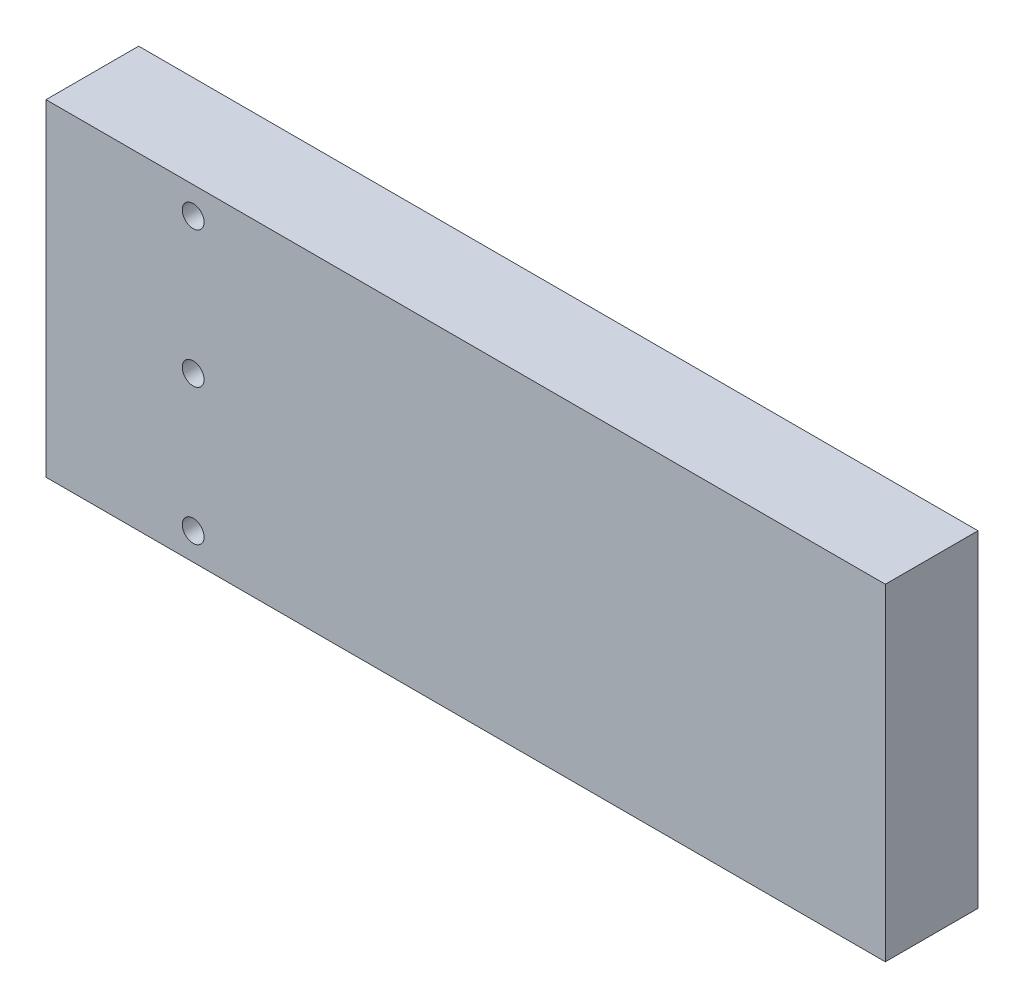
ISO-10303-21;
HEADER;
FILE_DESCRIPTION(('STEP AP214'),'2;1');
FILE_NAME('part.step','',(''),(''),'','','');
FILE_SCHEMA(('AUTOMOTIVE_DESIGN { 1 0 10303 214 1 1 1 1 }'));
ENDSEC;
DATA;
#1=APPLICATION_CONTEXT('core data for automotive mechanical design processes');
#2=APPLICATION_PROTOCOL_DEFINITION('international standard','automotive_design',2000,#1);
#3=PRODUCT_CONTEXT('',#1,'mechanical');
#4=PRODUCT('Part','Part','',(#3));
#5=PRODUCT_RELATED_PRODUCT_CATEGORY('part','',(#4));
#6=PRODUCT_DEFINITION_FORMATION('','',#4);
#7=PRODUCT_DEFINITION_CONTEXT('part definition',#1,'design');
#8=PRODUCT_DEFINITION('design','',#6,#7);
#9=PRODUCT_DEFINITION_SHAPE('','',#8);
#10=(LENGTH_UNIT() NAMED_UNIT(*) SI_UNIT(.MILLI.,.METRE.));
#11=(NAMED_UNIT(*) PLANE_ANGLE_UNIT() SI_UNIT($,.RADIAN.));
#12=(NAMED_UNIT(*) SI_UNIT($,.STERADIAN.) SOLID_ANGLE_UNIT());
#13=UNCERTAINTY_MEASURE_WITH_UNIT(LENGTH_MEASURE(1.E-05),#10,'distance_accuracy_value','');
#14=(GEOMETRIC_REPRESENTATION_CONTEXT(3) GLOBAL_UNCERTAINTY_ASSIGNED_CONTEXT((#13)) GLOBAL_UNIT_ASSIGNED_CONTEXT((#10,
#11,#12)) REPRESENTATION_CONTEXT('',''));
#15=CARTESIAN_POINT('',(0.,0.,0.));
#16=DIRECTION('',(0.,0.,1.));
#17=DIRECTION('',(1.,0.,0.));
#18=AXIS2_PLACEMENT_3D('',#15,#16,#17);
#19=CARTESIAN_POINT('',(0.,-60.,17.));
#20=DIRECTION('',(0.,1.,0.));
#21=DIRECTION('',(0.,0.,1.));
#22=AXIS2_PLACEMENT_3D('',#19,#20,#21);
#23=PLANE('',#22);
#24=DIRECTION('',(1.,0.,0.));
#25=VECTOR('',#24,1.);
#26=CARTESIAN_POINT('',(0.,-60.,0.));
#27=LINE('',#26,#25);
#28=CARTESIAN_POINT('',(0.,-60.,0.));
#29=VERTEX_POINT('',#28);
#30=CARTESIAN_POINT('',(154.,-60.,0.));
#31=VERTEX_POINT('',#30);
#32=EDGE_CURVE('E107',#29,#31,#27,.T.);
#33=ORIENTED_EDGE('',*,*,#32,.T.);
#34=DIRECTION('',(0.,0.,-1.));
#35=VECTOR('',#34,1.);
#36=CARTESIAN_POINT('',(154.,-60.,17.));
#37=LINE('',#36,#35);
#38=CARTESIAN_POINT('',(154.,-60.,17.));
#39=VERTEX_POINT('',#38);
#40=EDGE_CURVE('E11',#39,#31,#37,.T.);
#41=ORIENTED_EDGE('',*,*,#40,.F.);
#42=DIRECTION('',(1.,0.,0.));
#43=VECTOR('',#42,1.);
#44=CARTESIAN_POINT('',(0.,-60.,17.));
#45=LINE('',#44,#43);
#46=CARTESIAN_POINT('',(0.,-60.,17.));
#47=VERTEX_POINT('',#46);
#48=EDGE_CURVE('E83',#47,#39,#45,.T.);
#49=ORIENTED_EDGE('',*,*,#48,.F.);
#50=DIRECTION('',(0.,0.,-1.));
#51=VECTOR('',#50,1.);
#52=CARTESIAN_POINT('',(0.,-60.,17.));
#53=LINE('',#52,#51);
#54=EDGE_CURVE('E94',#47,#29,#53,.T.);
#55=ORIENTED_EDGE('',*,*,#54,.T.);
#56=EDGE_LOOP('',(#33,#41,#49,#55));
#57=FACE_BOUND('',#56,.T.);
#58=ADVANCED_FACE('F35',(#57),#23,.F.);
#59=CARTESIAN_POINT('',(154.,0.,17.));
#60=DIRECTION('',(-1.,0.,0.));
#61=DIRECTION('',(0.,0.,1.));
#62=AXIS2_PLACEMENT_3D('',#59,#60,#61);
#63=PLANE('',#62);
#64=DIRECTION('',(0.,1.,0.));
#65=VECTOR('',#64,1.);
#66=CARTESIAN_POINT('',(154.,0.,0.));
#67=LINE('',#66,#65);
#68=CARTESIAN_POINT('',(154.,0.,0.));
#69=VERTEX_POINT('',#68);
#70=EDGE_CURVE('E88',#31,#69,#67,.T.);
#71=ORIENTED_EDGE('',*,*,#70,.T.);
#72=DIRECTION('',(0.,0.,-1.));
#73=VECTOR('',#72,1.);
#74=CARTESIAN_POINT('',(154.,0.,17.));
#75=LINE('',#74,#73);
#76=CARTESIAN_POINT('',(154.,0.,17.));
#77=VERTEX_POINT('',#76);
#78=EDGE_CURVE('E44',#77,#69,#75,.T.);
#79=ORIENTED_EDGE('',*,*,#78,.F.);
#80=DIRECTION('',(0.,1.,0.));
#81=VECTOR('',#80,1.);
#82=CARTESIAN_POINT('',(154.,0.,17.));
#83=LINE('',#82,#81);
#84=EDGE_CURVE('E78',#39,#77,#83,.T.);
#85=ORIENTED_EDGE('',*,*,#84,.F.);
#86=ORIENTED_EDGE('',*,*,#40,.T.);
#87=EDGE_LOOP('',(#71,#79,#85,#86));
#88=FACE_BOUND('',#87,.T.);
#89=ADVANCED_FACE('F87',(#88),#63,.F.);
#90=CARTESIAN_POINT('',(0.,0.,17.));
#91=DIRECTION('',(0.,1.,0.));
#92=DIRECTION('',(0.,0.,1.));
#93=AXIS2_PLACEMENT_3D('',#90,#91,#92);
#94=PLANE('',#93);
#95=DIRECTION('',(1.,0.,0.));
#96=VECTOR('',#95,1.);
#97=CARTESIAN_POINT('',(0.,0.,0.));
#98=LINE('',#97,#96);
#99=CARTESIAN_POINT('',(0.,0.,0.));
#100=VERTEX_POINT('',#99);
#101=EDGE_CURVE('E111',#100,#69,#98,.T.);
#102=ORIENTED_EDGE('',*,*,#101,.F.);
#103=DIRECTION('',(0.,0.,-1.));
#104=VECTOR('',#103,1.);
#105=CARTESIAN_POINT('',(0.,0.,17.));
#106=LINE('',#105,#104);
#107=CARTESIAN_POINT('',(0.,0.,17.));
#108=VERTEX_POINT('',#107);
#109=EDGE_CURVE('E68',#108,#100,#106,.T.);
#110=ORIENTED_EDGE('',*,*,#109,.F.);
#111=DIRECTION('',(1.,0.,0.));
#112=VECTOR('',#111,1.);
#113=CARTESIAN_POINT('',(0.,0.,17.));
#114=LINE('',#113,#112);
#115=EDGE_CURVE('E81',#108,#77,#114,.T.);
#116=ORIENTED_EDGE('',*,*,#115,.T.);
#117=ORIENTED_EDGE('',*,*,#78,.T.);
#118=EDGE_LOOP('',(#102,#110,#116,#117));
#119=FACE_BOUND('',#118,.T.);
#120=ADVANCED_FACE('F92',(#119),#94,.T.);
#121=CARTESIAN_POINT('',(27.,-55.,17.));
#122=DIRECTION('',(0.,0.,-1.));
#123=DIRECTION('',(-1.,0.,0.));
#124=AXIS2_PLACEMENT_3D('',#121,#122,#123);
#125=CYLINDRICAL_SURFACE('',#124,2.);
#126=CARTESIAN_POINT('',(27.,-55.,17.));
#127=DIRECTION('',(0.,0.,1.));
#128=DIRECTION('',(1.,0.,0.));
#129=AXIS2_PLACEMENT_3D('',#126,#127,#128);
#130=CIRCLE('',#129,2.);
#131=CARTESIAN_POINT('',(29.,-55.,17.));
#132=VERTEX_POINT('',#131);
#133=EDGE_CURVE('E158',#132,#132,#130,.T.);
#134=ORIENTED_EDGE('',*,*,#133,.T.);
#135=EDGE_LOOP('',(#134));
#136=FACE_BOUND('',#135,.T.);
#137=CARTESIAN_POINT('',(27.,-55.,0.));
#138=DIRECTION('',(0.,0.,1.));
#139=DIRECTION('',(1.,0.,0.));
#140=AXIS2_PLACEMENT_3D('',#137,#138,#139);
#141=CIRCLE('',#140,2.);
#142=CARTESIAN_POINT('',(29.,-55.,0.));
#143=VERTEX_POINT('',#142);
#144=EDGE_CURVE('E104',#143,#143,#141,.T.);
#145=ORIENTED_EDGE('',*,*,#144,.F.);
#146=EDGE_LOOP('',(#145));
#147=FACE_BOUND('',#146,.T.);
#148=ADVANCED_FACE('F139',(#136,#147),#125,.F.);
#149=CARTESIAN_POINT('',(27.,-30.,17.));
#150=DIRECTION('',(0.,0.,-1.));
#151=DIRECTION('',(-1.,0.,0.));
#152=AXIS2_PLACEMENT_3D('',#149,#150,#151);
#153=CYLINDRICAL_SURFACE('',#152,2.);
#154=CARTESIAN_POINT('',(27.,-30.,17.));
#155=DIRECTION('',(0.,0.,1.));
#156=DIRECTION('',(1.,0.,0.));
#157=AXIS2_PLACEMENT_3D('',#154,#155,#156);
#158=CIRCLE('',#157,2.);
#159=CARTESIAN_POINT('',(29.,-30.,17.));
#160=VERTEX_POINT('',#159);
#161=EDGE_CURVE('E152',#160,#160,#158,.T.);
#162=ORIENTED_EDGE('',*,*,#161,.T.);
#163=EDGE_LOOP('',(#162));
#164=FACE_BOUND('',#163,.T.);
#165=CARTESIAN_POINT('',(27.,-30.,0.));
#166=DIRECTION('',(0.,0.,1.));
#167=DIRECTION('',(1.,0.,0.));
#168=AXIS2_PLACEMENT_3D('',#165,#166,#167);
#169=CIRCLE('',#168,2.);
#170=CARTESIAN_POINT('',(29.,-30.,0.));
#171=VERTEX_POINT('',#170);
#172=EDGE_CURVE('E101',#171,#171,#169,.T.);
#173=ORIENTED_EDGE('',*,*,#172,.F.);
#174=EDGE_LOOP('',(#173));
#175=FACE_BOUND('',#174,.T.);
#176=ADVANCED_FACE('F141',(#164,#175),#153,.F.);
#177=CARTESIAN_POINT('',(27.,-5.,17.));
#178=DIRECTION('',(0.,0.,-1.));
#179=DIRECTION('',(-1.,0.,0.));
#180=AXIS2_PLACEMENT_3D('',#177,#178,#179);
#181=CYLINDRICAL_SURFACE('',#180,2.);
#182=CARTESIAN_POINT('',(27.,-5.,17.));
#183=DIRECTION('',(0.,0.,1.));
#184=DIRECTION('',(1.,0.,0.));
#185=AXIS2_PLACEMENT_3D('',#182,#183,#184);
#186=CIRCLE('',#185,2.);
#187=CARTESIAN_POINT('',(29.,-5.,17.));
#188=VERTEX_POINT('',#187);
#189=EDGE_CURVE('E114',#188,#188,#186,.T.);
#190=ORIENTED_EDGE('',*,*,#189,.T.);
#191=EDGE_LOOP('',(#190));
#192=FACE_BOUND('',#191,.T.);
#193=CARTESIAN_POINT('',(27.,-5.,0.));
#194=DIRECTION('',(0.,0.,1.));
#195=DIRECTION('',(1.,0.,0.));
#196=AXIS2_PLACEMENT_3D('',#193,#194,#195);
#197=CIRCLE('',#196,2.);
#198=CARTESIAN_POINT('',(29.,-5.,0.));
#199=VERTEX_POINT('',#198);
#200=EDGE_CURVE('E98',#199,#199,#197,.T.);
#201=ORIENTED_EDGE('',*,*,#200,.F.);
#202=EDGE_LOOP('',(#201));
#203=FACE_BOUND('',#202,.T.);
#204=ADVANCED_FACE('F37',(#192,#203),#181,.F.);
#205=CARTESIAN_POINT('',(0.,0.,17.));
#206=DIRECTION('',(1.,0.,0.));
#207=DIRECTION('',(0.,1.,0.));
#208=AXIS2_PLACEMENT_3D('',#205,#206,#207);
#209=PLANE('',#208);
#210=DIRECTION('',(0.,-1.,0.));
#211=VECTOR('',#210,1.);
#212=CARTESIAN_POINT('',(0.,0.,0.));
#213=LINE('',#212,#211);
#214=EDGE_CURVE('E71',#100,#29,#213,.T.);
#215=ORIENTED_EDGE('',*,*,#214,.T.);
#216=ORIENTED_EDGE('',*,*,#54,.F.);
#217=DIRECTION('',(0.,-1.,0.));
#218=VECTOR('',#217,1.);
#219=CARTESIAN_POINT('',(0.,0.,17.));
#220=LINE('',#219,#218);
#221=EDGE_CURVE('E52',#108,#47,#220,.T.);
#222=ORIENTED_EDGE('',*,*,#221,.F.);
#223=ORIENTED_EDGE('',*,*,#109,.T.);
#224=EDGE_LOOP('',(#215,#216,#222,#223));
#225=FACE_BOUND('',#224,.T.);
#226=ADVANCED_FACE('F126',(#225),#209,.F.);
#227=CARTESIAN_POINT('',(0.,0.,17.));
#228=DIRECTION('',(0.,0.,1.));
#229=DIRECTION('',(1.,0.,0.));
#230=AXIS2_PLACEMENT_3D('',#227,#228,#229);
#231=PLANE('',#230);
#232=ORIENTED_EDGE('',*,*,#189,.F.);
#233=EDGE_LOOP('',(#232));
#234=FACE_BOUND('',#233,.T.);
#235=ORIENTED_EDGE('',*,*,#161,.F.);
#236=EDGE_LOOP('',(#235));
#237=FACE_BOUND('',#236,.T.);
#238=ORIENTED_EDGE('',*,*,#133,.F.);
#239=EDGE_LOOP('',(#238));
#240=FACE_BOUND('',#239,.T.);
#241=ORIENTED_EDGE('',*,*,#48,.T.);
#242=ORIENTED_EDGE('',*,*,#84,.T.);
#243=ORIENTED_EDGE('',*,*,#115,.F.);
#244=ORIENTED_EDGE('',*,*,#221,.T.);
#245=EDGE_LOOP('',(#241,#242,#243,#244));
#246=FACE_BOUND('',#245,.T.);
#247=ADVANCED_FACE('F79',(#234,#237,#240,#246),#231,.T.);
#248=CARTESIAN_POINT('',(0.,0.,0.));
#249=DIRECTION('',(0.,0.,1.));
#250=DIRECTION('',(1.,0.,0.));
#251=AXIS2_PLACEMENT_3D('',#248,#249,#250);
#252=PLANE('',#251);
#253=ORIENTED_EDGE('',*,*,#200,.T.);
#254=EDGE_LOOP('',(#253));
#255=FACE_BOUND('',#254,.T.);
#256=ORIENTED_EDGE('',*,*,#172,.T.);
#257=EDGE_LOOP('',(#256));
#258=FACE_BOUND('',#257,.T.);
#259=ORIENTED_EDGE('',*,*,#144,.T.);
#260=EDGE_LOOP('',(#259));
#261=FACE_BOUND('',#260,.T.);
#262=ORIENTED_EDGE('',*,*,#32,.F.);
#263=ORIENTED_EDGE('',*,*,#214,.F.);
#264=ORIENTED_EDGE('',*,*,#101,.T.);
#265=ORIENTED_EDGE('',*,*,#70,.F.);
#266=EDGE_LOOP('',(#262,#263,#264,#265));
#267=FACE_BOUND('',#266,.T.);
#268=ADVANCED_FACE('F119',(#255,#258,#261,#267),#252,.F.);
#269=CLOSED_SHELL('',(#58,#89,#120,#148,#176,#204,#226,#247,#268));
#270=MANIFOLD_SOLID_BREP('B2',#269);
#271=ADVANCED_BREP_SHAPE_REPRESENTATION('',(#18,#270),#14);
#272=SHAPE_DEFINITION_REPRESENTATION(#9,#271);
ENDSEC;
END-ISO-10303-21;
